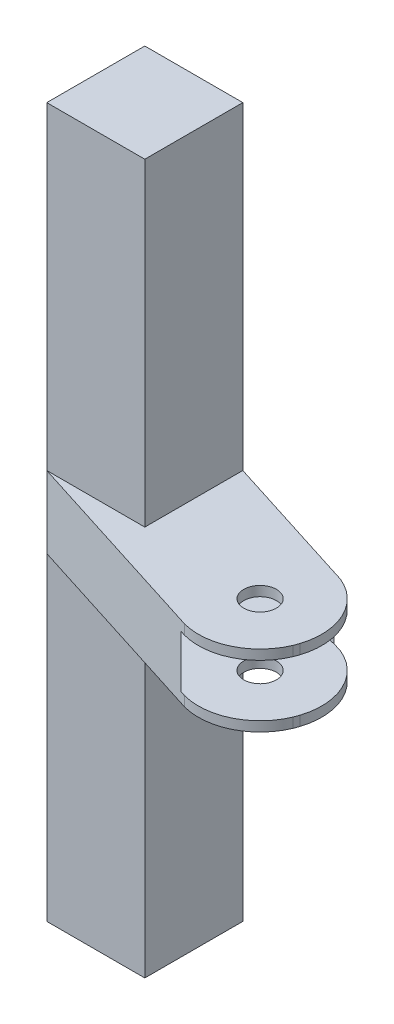
ISO-10303-21;
HEADER;
FILE_DESCRIPTION(('STEP AP214'),'2;1');
FILE_NAME('part.step','',(''),(''),'','','');
FILE_SCHEMA(('AUTOMOTIVE_DESIGN { 1 0 10303 214 1 1 1 1 }'));
ENDSEC;
DATA;
#1=APPLICATION_CONTEXT('core data for automotive mechanical design processes');
#2=APPLICATION_PROTOCOL_DEFINITION('international standard','automotive_design',2000,#1);
#3=PRODUCT_CONTEXT('',#1,'mechanical');
#4=PRODUCT('Part','Part','',(#3));
#5=PRODUCT_RELATED_PRODUCT_CATEGORY('part','',(#4));
#6=PRODUCT_DEFINITION_FORMATION('','',#4);
#7=PRODUCT_DEFINITION_CONTEXT('part definition',#1,'design');
#8=PRODUCT_DEFINITION('design','',#6,#7);
#9=PRODUCT_DEFINITION_SHAPE('','',#8);
#10=(LENGTH_UNIT() NAMED_UNIT(*) SI_UNIT(.MILLI.,.METRE.));
#11=(NAMED_UNIT(*) PLANE_ANGLE_UNIT() SI_UNIT($,.RADIAN.));
#12=(NAMED_UNIT(*) SI_UNIT($,.STERADIAN.) SOLID_ANGLE_UNIT());
#13=UNCERTAINTY_MEASURE_WITH_UNIT(LENGTH_MEASURE(1.E-05),#10,'distance_accuracy_value','');
#14=(GEOMETRIC_REPRESENTATION_CONTEXT(3) GLOBAL_UNCERTAINTY_ASSIGNED_CONTEXT((#13)) GLOBAL_UNIT_ASSIGNED_CONTEXT((#10,
#11,#12)) REPRESENTATION_CONTEXT('',''));
#15=CARTESIAN_POINT('',(0.,0.,0.));
#16=DIRECTION('',(0.,0.,1.));
#17=DIRECTION('',(1.,0.,0.));
#18=AXIS2_PLACEMENT_3D('',#15,#16,#17);
#19=CARTESIAN_POINT('',(0.,0.,0.));
#20=DIRECTION('',(0.,1.,0.));
#21=DIRECTION('',(0.,0.,1.));
#22=AXIS2_PLACEMENT_3D('',#19,#20,#21);
#23=PLANE('',#22);
#24=DIRECTION('',(0.,0.,1.));
#25=VECTOR('',#24,1.);
#26=CARTESIAN_POINT('',(-6.05504587155963,0.,0.));
#27=LINE('',#26,#25);
#28=CARTESIAN_POINT('',(-6.05504587155963,0.,-5.27064220183486));
#29=VERTEX_POINT('',#28);
#30=CARTESIAN_POINT('',(-6.05504587155964,0.,24.7293577981651));
#31=VERTEX_POINT('',#30);
#32=EDGE_CURVE('E717',#29,#31,#27,.T.);
#33=ORIENTED_EDGE('',*,*,#32,.T.);
#34=DIRECTION('',(-1.,0.,0.));
#35=VECTOR('',#34,1.);
#36=CARTESIAN_POINT('',(0.,0.,24.7293577981651));
#37=LINE('',#36,#35);
#38=CARTESIAN_POINT('',(-36.0550458715596,0.,24.7293577981651));
#39=VERTEX_POINT('',#38);
#40=EDGE_CURVE('E720',#31,#39,#37,.T.);
#41=ORIENTED_EDGE('',*,*,#40,.T.);
#42=DIRECTION('',(0.,0.,1.));
#43=VECTOR('',#42,1.);
#44=CARTESIAN_POINT('',(-36.0550458715596,0.,-5.27064220183486));
#45=LINE('',#44,#43);
#46=CARTESIAN_POINT('',(-36.0550458715596,0.,-5.27064220183486));
#47=VERTEX_POINT('',#46);
#48=EDGE_CURVE('E289',#47,#39,#45,.T.);
#49=ORIENTED_EDGE('',*,*,#48,.F.);
#50=DIRECTION('',(-1.,0.,0.));
#51=VECTOR('',#50,1.);
#52=CARTESIAN_POINT('',(-36.0550458715596,0.,-5.27064220183486));
#53=LINE('',#52,#51);
#54=EDGE_CURVE('E308',#29,#47,#53,.T.);
#55=ORIENTED_EDGE('',*,*,#54,.F.);
#56=EDGE_LOOP('',(#33,#41,#49,#55));
#57=FACE_BOUND('',#56,.T.);
#58=ADVANCED_FACE('F43',(#57),#23,.F.);
#59=CARTESIAN_POINT('',(-10.4155041147744,119.5,32.8569710340816));
#60=DIRECTION('',(0.302176376975282,0.,-0.953252032359802));
#61=DIRECTION('',(-0.953252032359802,0.,-0.302176376975282));
#62=AXIS2_PLACEMENT_3D('',#59,#60,#61);
#63=PLANE('',#62);
#64=DIRECTION('',(0.953252032359802,0.,0.302176376975282));
#65=VECTOR('',#64,1.);
#66=CARTESIAN_POINT('',(-10.4155041147744,97.5,32.8569710340816));
#67=LINE('',#66,#65);
#68=CARTESIAN_POINT('',(-36.0550458715596,97.5,24.7293577981651));
#69=VERTEX_POINT('',#68);
#70=CARTESIAN_POINT('',(25.6632165713357,97.5,44.2937545212811));
#71=VERTEX_POINT('',#70);
#72=EDGE_CURVE('E359',#69,#71,#67,.T.);
#73=ORIENTED_EDGE('',*,*,#72,.T.);
#74=DIRECTION('',(0.,-1.,0.));
#75=VECTOR('',#74,1.);
#76=CARTESIAN_POINT('',(25.6632165713357,100.5,44.2937545212811));
#77=LINE('',#76,#75);
#78=CARTESIAN_POINT('',(25.6632165713357,100.5,44.2937545212811));
#79=VERTEX_POINT('',#78);
#80=EDGE_CURVE('E215',#79,#71,#77,.T.);
#81=ORIENTED_EDGE('',*,*,#80,.F.);
#82=DIRECTION('',(0.953252032359802,0.,0.302176376975282));
#83=VECTOR('',#82,1.);
#84=CARTESIAN_POINT('',(-10.4155041147744,100.5,32.8569710340816));
#85=LINE('',#84,#83);
#86=CARTESIAN_POINT('',(24.0877510564104,100.5,43.7943394188856));
#87=VERTEX_POINT('',#86);
#88=EDGE_CURVE('E395',#87,#79,#85,.T.);
#89=ORIENTED_EDGE('',*,*,#88,.F.);
#90=DIRECTION('',(0.,-1.,0.));
#91=VECTOR('',#90,1.);
#92=CARTESIAN_POINT('',(24.0877510564104,116.5,43.7943394188856));
#93=LINE('',#92,#91);
#94=CARTESIAN_POINT('',(24.0877510564104,116.5,43.7943394188856));
#95=VERTEX_POINT('',#94);
#96=EDGE_CURVE('E259',#95,#87,#93,.T.);
#97=ORIENTED_EDGE('',*,*,#96,.F.);
#98=DIRECTION('',(0.953252032359802,0.,0.302176376975282));
#99=VECTOR('',#98,1.);
#100=CARTESIAN_POINT('',(-10.4155041147744,116.5,32.8569710340816));
#101=LINE('',#100,#99);
#102=CARTESIAN_POINT('',(25.6632165713357,116.5,44.2937545212811));
#103=VERTEX_POINT('',#102);
#104=EDGE_CURVE('E235',#95,#103,#101,.T.);
#105=ORIENTED_EDGE('',*,*,#104,.T.);
#106=DIRECTION('',(0.,-1.,0.));
#107=VECTOR('',#106,1.);
#108=CARTESIAN_POINT('',(25.6632165713357,119.5,44.2937545212811));
#109=LINE('',#108,#107);
#110=CARTESIAN_POINT('',(25.6632165713357,119.5,44.2937545212811));
#111=VERTEX_POINT('',#110);
#112=EDGE_CURVE('E290',#111,#103,#109,.T.);
#113=ORIENTED_EDGE('',*,*,#112,.F.);
#114=DIRECTION('',(0.953252032359802,0.,0.302176376975282));
#115=VECTOR('',#114,1.);
#116=CARTESIAN_POINT('',(-10.4155041147744,119.5,32.8569710340816));
#117=LINE('',#116,#115);
#118=CARTESIAN_POINT('',(-36.0550458715596,119.5,24.7293577981651));
#119=VERTEX_POINT('',#118);
#120=EDGE_CURVE('E277',#119,#111,#117,.T.);
#121=ORIENTED_EDGE('',*,*,#120,.F.);
#122=DIRECTION('',(0.,-1.,0.));
#123=VECTOR('',#122,1.);
#124=CARTESIAN_POINT('',(-36.0550458715596,119.5,24.7293577981651));
#125=LINE('',#124,#123);
#126=EDGE_CURVE('E286',#119,#69,#125,.T.);
#127=ORIENTED_EDGE('',*,*,#126,.T.);
#128=EDGE_LOOP('',(#73,#81,#89,#97,#105,#113,#121,#127));
#129=FACE_BOUND('',#128,.T.);
#130=ADVANCED_FACE('F356',(#129),#63,.F.);
#131=CARTESIAN_POINT('',(0.965320133767106,119.5,-3.04521944634541));
#132=DIRECTION('',(-0.302176376975282,0.,0.953252032359802));
#133=DIRECTION('',(0.953252032359802,0.,0.302176376975282));
#134=AXIS2_PLACEMENT_3D('',#131,#132,#133);
#135=PLANE('',#134);
#136=DIRECTION('',(-0.953252032359802,0.,-0.302176376975282));
#137=VECTOR('',#136,1.);
#138=CARTESIAN_POINT('',(0.965320133767106,97.5,-3.04521944634541));
#139=LINE('',#138,#137);
#140=CARTESIAN_POINT('',(37.6317572159582,97.5,8.57786735333382));
#141=VERTEX_POINT('',#140);
#142=CARTESIAN_POINT('',(-6.05504587155963,97.5,-5.27064220183486));
#143=VERTEX_POINT('',#142);
#144=EDGE_CURVE('E58',#141,#143,#139,.T.);
#145=ORIENTED_EDGE('',*,*,#144,.T.);
#146=DIRECTION('',(0.,-1.,0.));
#147=VECTOR('',#146,1.);
#148=CARTESIAN_POINT('',(-6.05504587155963,119.5,-5.27064220183486));
#149=LINE('',#148,#147);
#150=CARTESIAN_POINT('',(-6.05504587155963,119.5,-5.27064220183486));
#151=VERTEX_POINT('',#150);
#152=EDGE_CURVE('E285',#151,#143,#149,.T.);
#153=ORIENTED_EDGE('',*,*,#152,.F.);
#154=DIRECTION('',(-0.953252032359802,0.,-0.302176376975282));
#155=VECTOR('',#154,1.);
#156=CARTESIAN_POINT('',(0.965320133767106,119.5,-3.04521944634541));
#157=LINE('',#156,#155);
#158=CARTESIAN_POINT('',(37.6317572159582,119.5,8.57786735333382));
#159=VERTEX_POINT('',#158);
#160=EDGE_CURVE('E268',#159,#151,#157,.T.);
#161=ORIENTED_EDGE('',*,*,#160,.F.);
#162=DIRECTION('',(0.,-1.,0.));
#163=VECTOR('',#162,1.);
#164=CARTESIAN_POINT('',(37.6317572159582,119.5,8.57786735333382));
#165=LINE('',#164,#163);
#166=CARTESIAN_POINT('',(37.6317572159582,116.5,8.57786735333382));
#167=VERTEX_POINT('',#166);
#168=EDGE_CURVE('E299',#159,#167,#165,.T.);
#169=ORIENTED_EDGE('',*,*,#168,.T.);
#170=DIRECTION('',(-0.953252032359802,0.,-0.302176376975282));
#171=VECTOR('',#170,1.);
#172=CARTESIAN_POINT('',(0.965320133767106,116.5,-3.04521944634541));
#173=LINE('',#172,#171);
#174=CARTESIAN_POINT('',(34.8808589088709,116.5,7.70584562597882));
#175=VERTEX_POINT('',#174);
#176=EDGE_CURVE('E226',#167,#175,#173,.T.);
#177=ORIENTED_EDGE('',*,*,#176,.T.);
#178=DIRECTION('',(0.,-1.,0.));
#179=VECTOR('',#178,1.);
#180=CARTESIAN_POINT('',(34.8808589088709,116.5,7.70584562597881));
#181=LINE('',#180,#179);
#182=CARTESIAN_POINT('',(34.8808589088709,100.5,7.70584562597881));
#183=VERTEX_POINT('',#182);
#184=EDGE_CURVE('E261',#175,#183,#181,.T.);
#185=ORIENTED_EDGE('',*,*,#184,.T.);
#186=DIRECTION('',(-0.953252032359802,0.,-0.302176376975282));
#187=VECTOR('',#186,1.);
#188=CARTESIAN_POINT('',(0.965320133767106,100.5,-3.04521944634541));
#189=LINE('',#188,#187);
#190=CARTESIAN_POINT('',(37.6317572159582,100.5,8.57786735333382));
#191=VERTEX_POINT('',#190);
#192=EDGE_CURVE('E388',#191,#183,#189,.T.);
#193=ORIENTED_EDGE('',*,*,#192,.F.);
#194=DIRECTION('',(0.,-1.,0.));
#195=VECTOR('',#194,1.);
#196=CARTESIAN_POINT('',(37.6317572159582,100.5,8.57786735333382));
#197=LINE('',#196,#195);
#198=EDGE_CURVE('E213',#191,#141,#197,.T.);
#199=ORIENTED_EDGE('',*,*,#198,.T.);
#200=EDGE_LOOP('',(#145,#153,#161,#169,#177,#185,#193,#199));
#201=FACE_BOUND('',#200,.T.);
#202=ADVANCED_FACE('F337',(#201),#135,.F.);
#203=CARTESIAN_POINT('',(30.5715085198571,100.5,26.0752461601011));
#204=DIRECTION('',(0.,-1.,0.));
#205=DIRECTION('',(0.,0.,-1.));
#206=AXIS2_PLACEMENT_3D('',#203,#204,#205);
#207=CYLINDRICAL_SURFACE('',#206,18.8681047473853);
#208=ORIENTED_EDGE('',*,*,#80,.T.);
#209=CARTESIAN_POINT('',(30.5715085198571,97.5,26.0752461601011));
#210=DIRECTION('',(0.,-1.,0.));
#211=DIRECTION('',(0.,0.,-1.));
#212=AXIS2_PLACEMENT_3D('',#209,#210,#211);
#213=CIRCLE('',#212,18.8681047473853);
#214=CARTESIAN_POINT('',(47.9689901606505,97.5,33.3781914095577));
#215=VERTEX_POINT('',#214);
#216=EDGE_CURVE('E200',#215,#71,#213,.T.);
#217=ORIENTED_EDGE('',*,*,#216,.F.);
#218=DIRECTION('',(0.,-1.,0.));
#219=VECTOR('',#218,1.);
#220=CARTESIAN_POINT('',(47.9689901606505,100.5,33.3781914095577));
#221=LINE('',#220,#219);
#222=CARTESIAN_POINT('',(47.9689901606505,100.5,33.3781914095577));
#223=VERTEX_POINT('',#222);
#224=EDGE_CURVE('E208',#223,#215,#221,.T.);
#225=ORIENTED_EDGE('',*,*,#224,.F.);
#226=CARTESIAN_POINT('',(30.5715085198571,100.5,26.0752461601011));
#227=DIRECTION('',(0.,-1.,0.));
#228=DIRECTION('',(0.,0.,-1.));
#229=AXIS2_PLACEMENT_3D('',#226,#227,#228);
#230=CIRCLE('',#229,18.8681047473853);
#231=EDGE_CURVE('E396',#223,#79,#230,.T.);
#232=ORIENTED_EDGE('',*,*,#231,.T.);
#233=EDGE_LOOP('',(#208,#217,#225,#232));
#234=FACE_BOUND('',#233,.T.);
#235=ADVANCED_FACE('F413',(#234),#207,.T.);
#236=CARTESIAN_POINT('',(53.0600347067889,100.5,19.5864936980411));
#237=DIRECTION('',(-0.938124642710191,0.,-0.346297783330874));
#238=DIRECTION('',(-0.346297783330874,0.,0.938124642710191));
#239=AXIS2_PLACEMENT_3D('',#236,#237,#238);
#240=PLANE('',#239);
#241=DIRECTION('',(0.346297783330874,0.,-0.938124642710191));
#242=VECTOR('',#241,1.);
#243=CARTESIAN_POINT('',(53.0600347067889,97.5,19.5864936980411));
#244=LINE('',#243,#242);
#245=CARTESIAN_POINT('',(48.5413259092379,97.5,31.8277273422184));
#246=VERTEX_POINT('',#245);
#247=EDGE_CURVE('E194',#215,#246,#244,.T.);
#248=ORIENTED_EDGE('',*,*,#247,.T.);
#249=DIRECTION('',(0.,-1.,0.));
#250=VECTOR('',#249,1.);
#251=CARTESIAN_POINT('',(48.5413259092379,100.5,31.8277273422184));
#252=LINE('',#251,#250);
#253=CARTESIAN_POINT('',(48.5413259092379,100.5,31.8277273422184));
#254=VERTEX_POINT('',#253);
#255=EDGE_CURVE('E206',#254,#246,#252,.T.);
#256=ORIENTED_EDGE('',*,*,#255,.F.);
#257=DIRECTION('',(0.346297783330874,0.,-0.938124642710191));
#258=VECTOR('',#257,1.);
#259=CARTESIAN_POINT('',(53.0600347067889,100.5,19.5864936980411));
#260=LINE('',#259,#258);
#261=EDGE_CURVE('E397',#223,#254,#260,.T.);
#262=ORIENTED_EDGE('',*,*,#261,.F.);
#263=ORIENTED_EDGE('',*,*,#224,.T.);
#264=EDGE_LOOP('',(#248,#256,#262,#263));
#265=FACE_BOUND('',#264,.T.);
#266=ADVANCED_FACE('F204',(#265),#240,.F.);
#267=ORIENTED_EDGE('',*,*,#255,.T.);
#268=EDGE_CURVE('E191',#141,#246,#213,.T.);
#269=ORIENTED_EDGE('',*,*,#268,.F.);
#270=ORIENTED_EDGE('',*,*,#198,.F.);
#271=EDGE_CURVE('E212',#191,#254,#230,.T.);
#272=ORIENTED_EDGE('',*,*,#271,.T.);
#273=EDGE_LOOP('',(#267,#269,#270,#272));
#274=FACE_BOUND('',#273,.T.);
#275=ADVANCED_FACE('F210',(#274),#207,.T.);
#276=CARTESIAN_POINT('',(30.5715085198571,100.5,26.0752461601011));
#277=DIRECTION('',(0.,-1.,0.));
#278=DIRECTION('',(0.,0.,-1.));
#279=AXIS2_PLACEMENT_3D('',#276,#277,#278);
#280=CYLINDRICAL_SURFACE('',#279,5.);
#281=CARTESIAN_POINT('',(30.5715085198571,100.5,26.0752461601011));
#282=DIRECTION('',(0.,-1.,0.));
#283=DIRECTION('',(0.,0.,-1.));
#284=AXIS2_PLACEMENT_3D('',#281,#282,#283);
#285=CIRCLE('',#284,5.);
#286=CARTESIAN_POINT('',(30.5715085198571,100.5,21.0752461601011));
#287=VERTEX_POINT('',#286);
#288=EDGE_CURVE('E217',#287,#287,#285,.T.);
#289=ORIENTED_EDGE('',*,*,#288,.F.);
#290=EDGE_LOOP('',(#289));
#291=FACE_BOUND('',#290,.T.);
#292=CARTESIAN_POINT('',(30.5715085198571,97.5,26.0752461601011));
#293=DIRECTION('',(0.,-1.,0.));
#294=DIRECTION('',(0.,0.,-1.));
#295=AXIS2_PLACEMENT_3D('',#292,#293,#294);
#296=CIRCLE('',#295,5.);
#297=CARTESIAN_POINT('',(30.5715085198571,97.5,21.0752461601011));
#298=VERTEX_POINT('',#297);
#299=EDGE_CURVE('E715',#298,#298,#296,.T.);
#300=ORIENTED_EDGE('',*,*,#299,.T.);
#301=EDGE_LOOP('',(#300));
#302=FACE_BOUND('',#301,.T.);
#303=ADVANCED_FACE('F434',(#291,#302),#280,.F.);
#304=CARTESIAN_POINT('',(0.29986938486549,116.5,-0.982407606553388));
#305=DIRECTION('',(-0.291941851766884,0.,0.956436069576489));
#306=DIRECTION('',(0.956436069576489,0.,0.291941851766884));
#307=AXIS2_PLACEMENT_3D('',#304,#305,#306);
#308=PLANE('',#307);
#309=DIRECTION('',(0.,-1.,0.));
#310=VECTOR('',#309,1.);
#311=CARTESIAN_POINT('',(-6.05504587155963,116.5,-2.92217732749656));
#312=LINE('',#311,#310);
#313=CARTESIAN_POINT('',(-6.05504587155963,116.5,-2.92217732749656));
#314=VERTEX_POINT('',#313);
#315=CARTESIAN_POINT('',(-6.05504587155963,100.5,-2.92217732749656));
#316=VERTEX_POINT('',#315);
#317=EDGE_CURVE('E248',#314,#316,#312,.T.);
#318=ORIENTED_EDGE('',*,*,#317,.T.);
#319=DIRECTION('',(-0.956436069576489,0.,-0.291941851766884));
#320=VECTOR('',#319,1.);
#321=CARTESIAN_POINT('',(0.29986938486549,100.5,-0.982407606553388));
#322=LINE('',#321,#320);
#323=CARTESIAN_POINT('',(27.8001994914144,100.5,7.41177319746156));
#324=VERTEX_POINT('',#323);
#325=EDGE_CURVE('E389',#324,#316,#322,.T.);
#326=ORIENTED_EDGE('',*,*,#325,.F.);
#327=DIRECTION('',(0.,-1.,0.));
#328=VECTOR('',#327,1.);
#329=CARTESIAN_POINT('',(27.8001994914144,116.5,7.41177319746156));
#330=LINE('',#329,#328);
#331=CARTESIAN_POINT('',(27.8001994914144,116.5,7.41177319746156));
#332=VERTEX_POINT('',#331);
#333=EDGE_CURVE('E247',#332,#324,#330,.T.);
#334=ORIENTED_EDGE('',*,*,#333,.F.);
#335=DIRECTION('',(-0.956436069576489,0.,-0.291941851766884));
#336=VECTOR('',#335,1.);
#337=CARTESIAN_POINT('',(0.29986938486549,116.5,-0.982407606553388));
#338=LINE('',#337,#336);
#339=EDGE_CURVE('E221',#332,#314,#338,.T.);
#340=ORIENTED_EDGE('',*,*,#339,.T.);
#341=EDGE_LOOP('',(#318,#326,#334,#340));
#342=FACE_BOUND('',#341,.T.);
#343=ADVANCED_FACE('F432',(#342),#308,.T.);
#344=CARTESIAN_POINT('',(-6.05504587155963,116.5,0.));
#345=DIRECTION('',(1.,0.,0.));
#346=DIRECTION('',(0.,0.,-1.));
#347=AXIS2_PLACEMENT_3D('',#344,#345,#346);
#348=PLANE('',#347);
#349=DIRECTION('',(0.,-1.,0.));
#350=VECTOR('',#349,1.);
#351=CARTESIAN_POINT('',(-6.05504587155964,116.5,24.7293577981651));
#352=LINE('',#351,#350);
#353=CARTESIAN_POINT('',(-6.05504587155964,116.5,24.7293577981651));
#354=VERTEX_POINT('',#353);
#355=CARTESIAN_POINT('',(-6.05504587155964,100.5,24.7293577981651));
#356=VERTEX_POINT('',#355);
#357=EDGE_CURVE('E251',#354,#356,#352,.T.);
#358=ORIENTED_EDGE('',*,*,#357,.T.);
#359=DIRECTION('',(0.,0.,1.));
#360=VECTOR('',#359,1.);
#361=CARTESIAN_POINT('',(-6.05504587155963,100.5,0.));
#362=LINE('',#361,#360);
#363=EDGE_CURVE('E66',#316,#356,#362,.T.);
#364=ORIENTED_EDGE('',*,*,#363,.F.);
#365=ORIENTED_EDGE('',*,*,#317,.F.);
#366=DIRECTION('',(0.,0.,1.));
#367=VECTOR('',#366,1.);
#368=CARTESIAN_POINT('',(-6.05504587155963,116.5,0.));
#369=LINE('',#368,#367);
#370=EDGE_CURVE('E242',#314,#354,#369,.T.);
#371=ORIENTED_EDGE('',*,*,#370,.T.);
#372=EDGE_LOOP('',(#358,#364,#365,#371));
#373=FACE_BOUND('',#372,.T.);
#374=ADVANCED_FACE('F430',(#373),#348,.T.);
#375=CARTESIAN_POINT('',(0.,116.5,24.7293577981651));
#376=DIRECTION('',(0.,0.,1.));
#377=DIRECTION('',(1.,0.,0.));
#378=AXIS2_PLACEMENT_3D('',#375,#376,#377);
#379=PLANE('',#378);
#380=DIRECTION('',(0.,-1.,0.));
#381=VECTOR('',#380,1.);
#382=CARTESIAN_POINT('',(-27.7534787692139,116.5,24.7293577981651));
#383=LINE('',#382,#381);
#384=CARTESIAN_POINT('',(-27.7534787692139,116.5,24.7293577981651));
#385=VERTEX_POINT('',#384);
#386=CARTESIAN_POINT('',(-27.7534787692139,100.5,24.7293577981651));
#387=VERTEX_POINT('',#386);
#388=EDGE_CURVE('E253',#385,#387,#383,.T.);
#389=ORIENTED_EDGE('',*,*,#388,.T.);
#390=DIRECTION('',(-1.,0.,0.));
#391=VECTOR('',#390,1.);
#392=CARTESIAN_POINT('',(0.,100.5,24.7293577981651));
#393=LINE('',#392,#391);
#394=EDGE_CURVE('E408',#356,#387,#393,.T.);
#395=ORIENTED_EDGE('',*,*,#394,.F.);
#396=ORIENTED_EDGE('',*,*,#357,.F.);
#397=DIRECTION('',(-1.,0.,0.));
#398=VECTOR('',#397,1.);
#399=CARTESIAN_POINT('',(0.,116.5,24.7293577981651));
#400=LINE('',#399,#398);
#401=EDGE_CURVE('E240',#354,#385,#400,.T.);
#402=ORIENTED_EDGE('',*,*,#401,.T.);
#403=EDGE_LOOP('',(#389,#395,#396,#402));
#404=FACE_BOUND('',#403,.T.);
#405=ADVANCED_FACE('F429',(#404),#379,.T.);
#406=CARTESIAN_POINT('',(-9.65748335052139,116.5,30.4657025923589));
#407=DIRECTION('',(0.302176376975281,0.,-0.953252032359802));
#408=DIRECTION('',(-0.953252032359802,0.,-0.302176376975281));
#409=AXIS2_PLACEMENT_3D('',#406,#407,#408);
#410=PLANE('',#409);
#411=DIRECTION('',(0.,-1.,0.));
#412=VECTOR('',#411,1.);
#413=CARTESIAN_POINT('',(16.6424639953112,116.5,38.8026612704651));
#414=LINE('',#413,#412);
#415=CARTESIAN_POINT('',(16.6424639953112,116.5,38.8026612704651));
#416=VERTEX_POINT('',#415);
#417=CARTESIAN_POINT('',(16.6424639953112,100.5,38.8026612704651));
#418=VERTEX_POINT('',#417);
#419=EDGE_CURVE('E256',#416,#418,#414,.T.);
#420=ORIENTED_EDGE('',*,*,#419,.T.);
#421=DIRECTION('',(0.953252032359802,0.,0.302176376975281));
#422=VECTOR('',#421,1.);
#423=CARTESIAN_POINT('',(-9.65748335052139,100.5,30.4657025923589));
#424=LINE('',#423,#422);
#425=EDGE_CURVE('E394',#387,#418,#424,.T.);
#426=ORIENTED_EDGE('',*,*,#425,.F.);
#427=ORIENTED_EDGE('',*,*,#388,.F.);
#428=DIRECTION('',(0.953252032359802,0.,0.302176376975281));
#429=VECTOR('',#428,1.);
#430=CARTESIAN_POINT('',(-9.65748335052139,116.5,30.4657025923589));
#431=LINE('',#430,#429);
#432=EDGE_CURVE('E238',#385,#416,#431,.T.);
#433=ORIENTED_EDGE('',*,*,#432,.T.);
#434=EDGE_LOOP('',(#420,#426,#427,#433));
#435=FACE_BOUND('',#434,.T.);
#436=ADVANCED_FACE('F423',(#435),#410,.T.);
#437=CARTESIAN_POINT('',(30.5715085198571,116.5,26.0752461601011));
#438=DIRECTION('',(0.,-1.,0.));
#439=DIRECTION('',(0.,0.,-1.));
#440=AXIS2_PLACEMENT_3D('',#437,#438,#439);
#441=CYLINDRICAL_SURFACE('',#440,18.8681047473853);
#442=EDGE_CURVE('E391',#87,#418,#230,.T.);
#443=ORIENTED_EDGE('',*,*,#442,.T.);
#444=ORIENTED_EDGE('',*,*,#419,.F.);
#445=CARTESIAN_POINT('',(30.5715085198571,116.5,26.0752461601011));
#446=DIRECTION('',(0.,-1.,0.));
#447=DIRECTION('',(0.,0.,-1.));
#448=AXIS2_PLACEMENT_3D('',#445,#446,#447);
#449=CIRCLE('',#448,18.8681047473853);
#450=EDGE_CURVE('E227',#95,#416,#449,.T.);
#451=ORIENTED_EDGE('',*,*,#450,.F.);
#452=ORIENTED_EDGE('',*,*,#96,.T.);
#453=EDGE_LOOP('',(#443,#444,#451,#452));
#454=FACE_BOUND('',#453,.T.);
#455=ADVANCED_FACE('F419',(#454),#441,.F.);
#456=EDGE_CURVE('E385',#324,#183,#230,.T.);
#457=ORIENTED_EDGE('',*,*,#456,.T.);
#458=ORIENTED_EDGE('',*,*,#184,.F.);
#459=EDGE_CURVE('E224',#332,#175,#449,.T.);
#460=ORIENTED_EDGE('',*,*,#459,.F.);
#461=ORIENTED_EDGE('',*,*,#333,.T.);
#462=EDGE_LOOP('',(#457,#458,#460,#461));
#463=FACE_BOUND('',#462,.T.);
#464=ADVANCED_FACE('F383',(#463),#441,.F.);
#465=CARTESIAN_POINT('',(30.5715085198571,119.5,26.0752461601011));
#466=DIRECTION('',(0.,-1.,0.));
#467=DIRECTION('',(0.,0.,-1.));
#468=AXIS2_PLACEMENT_3D('',#465,#466,#467);
#469=CYLINDRICAL_SURFACE('',#468,18.8681047473853);
#470=ORIENTED_EDGE('',*,*,#112,.T.);
#471=CARTESIAN_POINT('',(47.9689901606505,116.5,33.3781914095577));
#472=VERTEX_POINT('',#471);
#473=EDGE_CURVE('E234',#472,#103,#449,.T.);
#474=ORIENTED_EDGE('',*,*,#473,.F.);
#475=DIRECTION('',(0.,-1.,0.));
#476=VECTOR('',#475,1.);
#477=CARTESIAN_POINT('',(47.9689901606505,119.5,33.3781914095577));
#478=LINE('',#477,#476);
#479=CARTESIAN_POINT('',(47.9689901606505,119.5,33.3781914095577));
#480=VERTEX_POINT('',#479);
#481=EDGE_CURVE('E293',#480,#472,#478,.T.);
#482=ORIENTED_EDGE('',*,*,#481,.F.);
#483=CARTESIAN_POINT('',(30.5715085198571,119.5,26.0752461601011));
#484=DIRECTION('',(0.,-1.,0.));
#485=DIRECTION('',(0.,0.,-1.));
#486=AXIS2_PLACEMENT_3D('',#483,#484,#485);
#487=CIRCLE('',#486,18.8681047473853);
#488=EDGE_CURVE('E275',#480,#111,#487,.T.);
#489=ORIENTED_EDGE('',*,*,#488,.T.);
#490=EDGE_LOOP('',(#470,#474,#482,#489));
#491=FACE_BOUND('',#490,.T.);
#492=ADVANCED_FACE('F367',(#491),#469,.T.);
#493=CARTESIAN_POINT('',(53.0600347067889,119.5,19.5864936980411));
#494=DIRECTION('',(-0.938124642710191,0.,-0.346297783330874));
#495=DIRECTION('',(-0.346297783330874,0.,0.938124642710191));
#496=AXIS2_PLACEMENT_3D('',#493,#494,#495);
#497=PLANE('',#496);
#498=DIRECTION('',(0.346297783330874,0.,-0.938124642710191));
#499=VECTOR('',#498,1.);
#500=CARTESIAN_POINT('',(53.0600347067889,116.5,19.5864936980411));
#501=LINE('',#500,#499);
#502=CARTESIAN_POINT('',(48.5413259092379,116.5,31.8277273422184));
#503=VERTEX_POINT('',#502);
#504=EDGE_CURVE('E231',#472,#503,#501,.T.);
#505=ORIENTED_EDGE('',*,*,#504,.T.);
#506=DIRECTION('',(0.,-1.,0.));
#507=VECTOR('',#506,1.);
#508=CARTESIAN_POINT('',(48.5413259092379,119.5,31.8277273422184));
#509=LINE('',#508,#507);
#510=CARTESIAN_POINT('',(48.5413259092379,119.5,31.8277273422184));
#511=VERTEX_POINT('',#510);
#512=EDGE_CURVE('E296',#511,#503,#509,.T.);
#513=ORIENTED_EDGE('',*,*,#512,.F.);
#514=DIRECTION('',(0.346297783330874,0.,-0.938124642710191));
#515=VECTOR('',#514,1.);
#516=CARTESIAN_POINT('',(53.0600347067889,119.5,19.5864936980411));
#517=LINE('',#516,#515);
#518=EDGE_CURVE('E274',#480,#511,#517,.T.);
#519=ORIENTED_EDGE('',*,*,#518,.F.);
#520=ORIENTED_EDGE('',*,*,#481,.T.);
#521=EDGE_LOOP('',(#505,#513,#519,#520));
#522=FACE_BOUND('',#521,.T.);
#523=ADVANCED_FACE('F370',(#522),#497,.F.);
#524=ORIENTED_EDGE('',*,*,#512,.T.);
#525=EDGE_CURVE('E228',#167,#503,#449,.T.);
#526=ORIENTED_EDGE('',*,*,#525,.F.);
#527=ORIENTED_EDGE('',*,*,#168,.F.);
#528=EDGE_CURVE('E271',#159,#511,#487,.T.);
#529=ORIENTED_EDGE('',*,*,#528,.T.);
#530=EDGE_LOOP('',(#524,#526,#527,#529));
#531=FACE_BOUND('',#530,.T.);
#532=ADVANCED_FACE('F373',(#531),#469,.T.);
#533=CARTESIAN_POINT('',(30.5715085198571,119.5,26.0752461601011));
#534=DIRECTION('',(0.,-1.,0.));
#535=DIRECTION('',(0.,0.,-1.));
#536=AXIS2_PLACEMENT_3D('',#533,#534,#535);
#537=CYLINDRICAL_SURFACE('',#536,5.);
#538=CARTESIAN_POINT('',(30.5715085198571,119.5,26.0752461601011));
#539=DIRECTION('',(0.,-1.,0.));
#540=DIRECTION('',(0.,0.,-1.));
#541=AXIS2_PLACEMENT_3D('',#538,#539,#540);
#542=CIRCLE('',#541,5.);
#543=CARTESIAN_POINT('',(30.5715085198571,119.5,21.0752461601011));
#544=VERTEX_POINT('',#543);
#545=EDGE_CURVE('E282',#544,#544,#542,.T.);
#546=CARTESIAN_POINT('',(30.5715085198571,116.5,26.0752461601011));
#547=DIRECTION('',(0.,-1.,0.));
#548=DIRECTION('',(0.,0.,-1.));
#549=AXIS2_PLACEMENT_3D('',#546,#547,#548);
#550=CIRCLE('',#549,5.);
#551=CARTESIAN_POINT('',(30.5715085198571,116.5,21.0752461601011));
#552=VERTEX_POINT('',#551);
#553=EDGE_CURVE('E244',#552,#552,#550,.T.);
#554=CARTESIAN_POINT('',(30.5715085198571,119.5,21.0752461601011));
#555=CARTESIAN_POINT('',(30.5715085198571,119.46875,21.0752461601011));
#556=CARTESIAN_POINT('',(30.5715085198571,119.4375,21.0752461601011));
#557=CARTESIAN_POINT('',(30.5715085198571,119.375,21.0752461601011));
#558=CARTESIAN_POINT('',(30.5715085198571,119.34375,21.0752461601011));
#559=CARTESIAN_POINT('',(30.5715085198571,119.28125,21.0752461601011));
#560=CARTESIAN_POINT('',(30.5715085198571,119.25,21.0752461601011));
#561=CARTESIAN_POINT('',(30.5715085198571,119.1875,21.0752461601011));
#562=CARTESIAN_POINT('',(30.5715085198571,119.15625,21.0752461601011));
#563=CARTESIAN_POINT('',(30.5715085198571,119.09375,21.0752461601011));
#564=CARTESIAN_POINT('',(30.5715085198571,119.0625,21.0752461601011));
#565=CARTESIAN_POINT('',(30.5715085198571,119.,21.0752461601011));
#566=CARTESIAN_POINT('',(30.5715085198571,118.96875,21.0752461601011));
#567=CARTESIAN_POINT('',(30.5715085198571,118.90625,21.0752461601011));
#568=CARTESIAN_POINT('',(30.5715085198571,118.875,21.0752461601011));
#569=CARTESIAN_POINT('',(30.5715085198571,118.8125,21.0752461601011));
#570=CARTESIAN_POINT('',(30.5715085198571,118.78125,21.0752461601011));
#571=CARTESIAN_POINT('',(30.5715085198571,118.71875,21.0752461601011));
#572=CARTESIAN_POINT('',(30.5715085198571,118.6875,21.0752461601011));
#573=CARTESIAN_POINT('',(30.5715085198571,118.625,21.0752461601011));
#574=CARTESIAN_POINT('',(30.5715085198571,118.59375,21.0752461601011));
#575=CARTESIAN_POINT('',(30.5715085198571,118.53125,21.0752461601011));
#576=CARTESIAN_POINT('',(30.5715085198571,118.5,21.0752461601011));
#577=CARTESIAN_POINT('',(30.5715085198571,118.4375,21.0752461601011));
#578=CARTESIAN_POINT('',(30.5715085198571,118.40625,21.0752461601011));
#579=CARTESIAN_POINT('',(30.5715085198571,118.34375,21.0752461601011));
#580=CARTESIAN_POINT('',(30.5715085198571,118.3125,21.0752461601011));
#581=CARTESIAN_POINT('',(30.5715085198571,118.25,21.0752461601011));
#582=CARTESIAN_POINT('',(30.5715085198571,118.21875,21.0752461601011));
#583=CARTESIAN_POINT('',(30.5715085198571,118.15625,21.0752461601011));
#584=CARTESIAN_POINT('',(30.5715085198571,118.125,21.0752461601011));
#585=CARTESIAN_POINT('',(30.5715085198571,118.0625,21.0752461601011));
#586=CARTESIAN_POINT('',(30.5715085198571,118.03125,21.0752461601011));
#587=CARTESIAN_POINT('',(30.5715085198571,117.96875,21.0752461601011));
#588=CARTESIAN_POINT('',(30.5715085198571,117.9375,21.0752461601011));
#589=CARTESIAN_POINT('',(30.5715085198571,117.875,21.0752461601011));
#590=CARTESIAN_POINT('',(30.5715085198571,117.84375,21.0752461601011));
#591=CARTESIAN_POINT('',(30.5715085198571,117.78125,21.0752461601011));
#592=CARTESIAN_POINT('',(30.5715085198571,117.75,21.0752461601011));
#593=CARTESIAN_POINT('',(30.5715085198571,117.6875,21.0752461601011));
#594=CARTESIAN_POINT('',(30.5715085198571,117.65625,21.0752461601011));
#595=CARTESIAN_POINT('',(30.5715085198571,117.59375,21.0752461601011));
#596=CARTESIAN_POINT('',(30.5715085198571,117.5625,21.0752461601011));
#597=CARTESIAN_POINT('',(30.5715085198571,117.5,21.0752461601011));
#598=CARTESIAN_POINT('',(30.5715085198571,117.46875,21.0752461601011));
#599=CARTESIAN_POINT('',(30.5715085198571,117.40625,21.0752461601011));
#600=CARTESIAN_POINT('',(30.5715085198571,117.375,21.0752461601011));
#601=CARTESIAN_POINT('',(30.5715085198571,117.3125,21.0752461601011));
#602=CARTESIAN_POINT('',(30.5715085198571,117.28125,21.0752461601011));
#603=CARTESIAN_POINT('',(30.5715085198571,117.21875,21.0752461601011));
#604=CARTESIAN_POINT('',(30.5715085198571,117.1875,21.0752461601011));
#605=CARTESIAN_POINT('',(30.5715085198571,117.125,21.0752461601011));
#606=CARTESIAN_POINT('',(30.5715085198571,117.09375,21.0752461601011));
#607=CARTESIAN_POINT('',(30.5715085198571,117.03125,21.0752461601011));
#608=CARTESIAN_POINT('',(30.5715085198571,117.,21.0752461601011));
#609=CARTESIAN_POINT('',(30.5715085198571,116.9375,21.0752461601011));
#610=CARTESIAN_POINT('',(30.5715085198571,116.90625,21.0752461601011));
#611=CARTESIAN_POINT('',(30.5715085198571,116.84375,21.0752461601011));
#612=CARTESIAN_POINT('',(30.5715085198571,116.8125,21.0752461601011));
#613=CARTESIAN_POINT('',(30.5715085198571,116.75,21.0752461601011));
#614=CARTESIAN_POINT('',(30.5715085198571,116.71875,21.0752461601011));
#615=CARTESIAN_POINT('',(30.5715085198571,116.65625,21.0752461601011));
#616=CARTESIAN_POINT('',(30.5715085198571,116.625,21.0752461601011));
#617=CARTESIAN_POINT('',(30.5715085198571,116.5625,21.0752461601011));
#618=CARTESIAN_POINT('',(30.5715085198571,116.53125,21.0752461601011));
#619=CARTESIAN_POINT('',(30.5715085198571,116.5,21.0752461601011));
#620=B_SPLINE_CURVE_WITH_KNOTS('',3,(#554,#555,#556,#557,#558,#559,#560,#561,#562,#563,#564,
#565,#566,#567,#568,#569,#570,#571,#572,#573,#574,#575,#576,#577,#578,#579,#580,#581,#582,#583,
#584,#585,#586,#587,#588,#589,#590,#591,#592,#593,#594,#595,#596,#597,#598,#599,#600,#601,#602,
#603,#604,#605,#606,#607,#608,#609,#610,#611,#612,#613,#614,#615,#616,#617,#618,#619),
.UNSPECIFIED.,.F.,.F.,(4,2,2,2,2,2,2,2,2,2,2,2,2,2,2,2,2,2,2,2,2,2,2,2,2,2,2,2,2,2,2,2,4),(0.,
0.0937500000000036,0.187500000000007,0.281250000000011,0.375,0.468750000000004,
0.562500000000007,0.656250000000011,0.750000000000001,0.843750000000004,0.937500000000008,
1.03125,1.125,1.21875,1.31250000000001,1.40625,1.5,1.59375,1.68749999999999,1.78125,1.875,
1.96875000000001,2.06249999999999,2.15625,2.25,2.34374999999999,2.4375,2.53125,2.625,
2.71874999999999,2.8125,2.90625,3.),.UNSPECIFIED.);
#621=EDGE_CURVE('BSEAM462',#544,#552,#620,.T.);
#622=ORIENTED_EDGE('',*,*,#545,.F.);
#623=ORIENTED_EDGE('',*,*,#553,.T.);
#624=ORIENTED_EDGE('',*,*,#621,.T.);
#625=ORIENTED_EDGE('',*,*,#621,.F.);
#626=EDGE_LOOP('',(#622,#624,#623,#625));
#627=FACE_BOUND('',#626,.T.);
#628=ADVANCED_FACE('F462',(#627),#537,.F.);
#629=CARTESIAN_POINT('',(-36.0550458715596,217.,24.7293577981651));
#630=DIRECTION('',(0.,0.,-1.));
#631=DIRECTION('',(-1.,0.,0.));
#632=AXIS2_PLACEMENT_3D('',#629,#630,#631);
#633=PLANE('',#632);
#634=DIRECTION('',(-1.,0.,0.));
#635=VECTOR('',#634,1.);
#636=CARTESIAN_POINT('',(0.,119.5,24.7293577981651));
#637=LINE('',#636,#635);
#638=CARTESIAN_POINT('',(-6.05504587155963,119.5,24.7293577981651));
#639=VERTEX_POINT('',#638);
#640=EDGE_CURVE('E279',#639,#119,#637,.T.);
#641=ORIENTED_EDGE('',*,*,#640,.F.);
#642=DIRECTION('',(0.,-1.,0.));
#643=VECTOR('',#642,1.);
#644=CARTESIAN_POINT('',(-6.05504587155963,217.,24.7293577981651));
#645=LINE('',#644,#643);
#646=CARTESIAN_POINT('',(-6.05504587155963,217.,24.7293577981651));
#647=VERTEX_POINT('',#646);
#648=EDGE_CURVE('E51',#647,#639,#645,.T.);
#649=ORIENTED_EDGE('',*,*,#648,.F.);
#650=DIRECTION('',(1.,0.,0.));
#651=VECTOR('',#650,1.);
#652=CARTESIAN_POINT('',(-36.0550458715596,217.,24.7293577981651));
#653=LINE('',#652,#651);
#654=CARTESIAN_POINT('',(-36.0550458715596,217.,24.7293577981651));
#655=VERTEX_POINT('',#654);
#656=EDGE_CURVE('E307',#655,#647,#653,.T.);
#657=ORIENTED_EDGE('',*,*,#656,.F.);
#658=DIRECTION('',(0.,-1.,0.));
#659=VECTOR('',#658,1.);
#660=CARTESIAN_POINT('',(-36.0550458715596,217.,24.7293577981651));
#661=LINE('',#660,#659);
#662=EDGE_CURVE('E12',#655,#119,#661,.T.);
#663=ORIENTED_EDGE('',*,*,#662,.T.);
#664=EDGE_LOOP('',(#641,#649,#657,#663));
#665=FACE_BOUND('',#664,.T.);
#666=ADVANCED_FACE('F350',(#665),#633,.F.);
#667=CARTESIAN_POINT('',(-6.05504587155963,217.,-5.27064220183486));
#668=DIRECTION('',(-1.,0.,0.));
#669=DIRECTION('',(0.,0.,1.));
#670=AXIS2_PLACEMENT_3D('',#667,#668,#669);
#671=PLANE('',#670);
#672=DIRECTION('',(0.,0.,1.));
#673=VECTOR('',#672,1.);
#674=CARTESIAN_POINT('',(-6.05504587155963,119.5,0.));
#675=LINE('',#674,#673);
#676=EDGE_CURVE('E250',#151,#639,#675,.T.);
#677=ORIENTED_EDGE('',*,*,#676,.F.);
#678=DIRECTION('',(0.,-1.,0.));
#679=VECTOR('',#678,1.);
#680=CARTESIAN_POINT('',(-6.05504587155963,217.,-5.27064220183486));
#681=LINE('',#680,#679);
#682=CARTESIAN_POINT('',(-6.05504587155963,217.,-5.27064220183486));
#683=VERTEX_POINT('',#682);
#684=EDGE_CURVE('E320',#683,#151,#681,.T.);
#685=ORIENTED_EDGE('',*,*,#684,.F.);
#686=DIRECTION('',(0.,0.,-1.));
#687=VECTOR('',#686,1.);
#688=CARTESIAN_POINT('',(-6.05504587155963,217.,-5.27064220183486));
#689=LINE('',#688,#687);
#690=EDGE_CURVE('E310',#647,#683,#689,.T.);
#691=ORIENTED_EDGE('',*,*,#690,.F.);
#692=ORIENTED_EDGE('',*,*,#648,.T.);
#693=EDGE_LOOP('',(#677,#685,#691,#692));
#694=FACE_BOUND('',#693,.T.);
#695=ADVANCED_FACE('F326',(#694),#671,.F.);
#696=CARTESIAN_POINT('',(-36.0550458715596,217.,-5.27064220183486));
#697=DIRECTION('',(1.,0.,0.));
#698=DIRECTION('',(0.,0.,-1.));
#699=AXIS2_PLACEMENT_3D('',#696,#697,#698);
#700=PLANE('',#699);
#701=ORIENTED_EDGE('',*,*,#48,.T.);
#702=DIRECTION('',(0.,-1.,0.));
#703=VECTOR('',#702,1.);
#704=CARTESIAN_POINT('',(-36.0550458715596,97.5,24.7293577981651));
#705=LINE('',#704,#703);
#706=EDGE_CURVE('E353',#69,#39,#705,.T.);
#707=ORIENTED_EDGE('',*,*,#706,.F.);
#708=ORIENTED_EDGE('',*,*,#126,.F.);
#709=ORIENTED_EDGE('',*,*,#662,.F.);
#710=DIRECTION('',(0.,0.,1.));
#711=VECTOR('',#710,1.);
#712=CARTESIAN_POINT('',(-36.0550458715596,217.,-5.27064220183486));
#713=LINE('',#712,#711);
#714=CARTESIAN_POINT('',(-36.0550458715596,217.,-5.27064220183486));
#715=VERTEX_POINT('',#714);
#716=EDGE_CURVE('E304',#715,#655,#713,.T.);
#717=ORIENTED_EDGE('',*,*,#716,.F.);
#718=DIRECTION('',(0.,-1.,0.));
#719=VECTOR('',#718,1.);
#720=CARTESIAN_POINT('',(-36.0550458715596,217.,-5.27064220183486));
#721=LINE('',#720,#719);
#722=EDGE_CURVE('E314',#715,#47,#721,.T.);
#723=ORIENTED_EDGE('',*,*,#722,.T.);
#724=EDGE_LOOP('',(#701,#707,#708,#709,#717,#723));
#725=FACE_BOUND('',#724,.T.);
#726=ADVANCED_FACE('F45',(#725),#700,.F.);
#727=CARTESIAN_POINT('',(-36.0550458715596,217.,-5.27064220183486));
#728=DIRECTION('',(0.,0.,1.));
#729=DIRECTION('',(1.,0.,0.));
#730=AXIS2_PLACEMENT_3D('',#727,#728,#729);
#731=PLANE('',#730);
#732=ORIENTED_EDGE('',*,*,#54,.T.);
#733=ORIENTED_EDGE('',*,*,#722,.F.);
#734=DIRECTION('',(-1.,0.,0.));
#735=VECTOR('',#734,1.);
#736=CARTESIAN_POINT('',(-36.0550458715596,217.,-5.27064220183486));
#737=LINE('',#736,#735);
#738=EDGE_CURVE('E312',#683,#715,#737,.T.);
#739=ORIENTED_EDGE('',*,*,#738,.F.);
#740=ORIENTED_EDGE('',*,*,#684,.T.);
#741=ORIENTED_EDGE('',*,*,#152,.T.);
#742=DIRECTION('',(0.,-1.,0.));
#743=VECTOR('',#742,1.);
#744=CARTESIAN_POINT('',(-6.05504587155963,97.5,-5.27064220183486));
#745=LINE('',#744,#743);
#746=EDGE_CURVE('E342',#143,#29,#745,.T.);
#747=ORIENTED_EDGE('',*,*,#746,.T.);
#748=EDGE_LOOP('',(#732,#733,#739,#740,#741,#747));
#749=FACE_BOUND('',#748,.T.);
#750=ADVANCED_FACE('F340',(#749),#731,.F.);
#751=CARTESIAN_POINT('',(0.,217.,0.));
#752=DIRECTION('',(0.,1.,0.));
#753=DIRECTION('',(0.,0.,1.));
#754=AXIS2_PLACEMENT_3D('',#751,#752,#753);
#755=PLANE('',#754);
#756=ORIENTED_EDGE('',*,*,#716,.T.);
#757=ORIENTED_EDGE('',*,*,#656,.T.);
#758=ORIENTED_EDGE('',*,*,#690,.T.);
#759=ORIENTED_EDGE('',*,*,#738,.T.);
#760=EDGE_LOOP('',(#756,#757,#758,#759));
#761=FACE_BOUND('',#760,.T.);
#762=ADVANCED_FACE('F348',(#761),#755,.T.);
#763=CARTESIAN_POINT('',(0.,119.5,0.));
#764=DIRECTION('',(0.,-1.,0.));
#765=DIRECTION('',(0.,0.,-1.));
#766=AXIS2_PLACEMENT_3D('',#763,#764,#765);
#767=PLANE('',#766);
#768=ORIENTED_EDGE('',*,*,#676,.T.);
#769=ORIENTED_EDGE('',*,*,#640,.T.);
#770=ORIENTED_EDGE('',*,*,#120,.T.);
#771=ORIENTED_EDGE('',*,*,#488,.F.);
#772=ORIENTED_EDGE('',*,*,#518,.T.);
#773=ORIENTED_EDGE('',*,*,#528,.F.);
#774=ORIENTED_EDGE('',*,*,#160,.T.);
#775=EDGE_LOOP('',(#768,#769,#770,#771,#772,#773,#774));
#776=FACE_BOUND('',#775,.T.);
#777=ORIENTED_EDGE('',*,*,#545,.T.);
#778=EDGE_LOOP('',(#777));
#779=FACE_BOUND('',#778,.T.);
#780=ADVANCED_FACE('F330',(#776,#779),#767,.F.);
#781=CARTESIAN_POINT('',(0.,116.5,0.));
#782=DIRECTION('',(0.,-1.,0.));
#783=DIRECTION('',(0.,0.,-1.));
#784=AXIS2_PLACEMENT_3D('',#781,#782,#783);
#785=PLANE('',#784);
#786=ORIENTED_EDGE('',*,*,#339,.F.);
#787=ORIENTED_EDGE('',*,*,#459,.T.);
#788=ORIENTED_EDGE('',*,*,#176,.F.);
#789=ORIENTED_EDGE('',*,*,#525,.T.);
#790=ORIENTED_EDGE('',*,*,#504,.F.);
#791=ORIENTED_EDGE('',*,*,#473,.T.);
#792=ORIENTED_EDGE('',*,*,#104,.F.);
#793=ORIENTED_EDGE('',*,*,#450,.T.);
#794=ORIENTED_EDGE('',*,*,#432,.F.);
#795=ORIENTED_EDGE('',*,*,#401,.F.);
#796=ORIENTED_EDGE('',*,*,#370,.F.);
#797=EDGE_LOOP('',(#786,#787,#788,#789,#790,#791,#792,#793,#794,#795,#796));
#798=FACE_BOUND('',#797,.T.);
#799=ORIENTED_EDGE('',*,*,#553,.F.);
#800=EDGE_LOOP('',(#799));
#801=FACE_BOUND('',#800,.T.);
#802=ADVANCED_FACE('F379',(#798,#801),#785,.T.);
#803=CARTESIAN_POINT('',(0.,100.5,0.));
#804=DIRECTION('',(0.,-1.,0.));
#805=DIRECTION('',(0.,0.,-1.));
#806=AXIS2_PLACEMENT_3D('',#803,#804,#805);
#807=PLANE('',#806);
#808=ORIENTED_EDGE('',*,*,#325,.T.);
#809=ORIENTED_EDGE('',*,*,#363,.T.);
#810=ORIENTED_EDGE('',*,*,#394,.T.);
#811=ORIENTED_EDGE('',*,*,#425,.T.);
#812=ORIENTED_EDGE('',*,*,#442,.F.);
#813=ORIENTED_EDGE('',*,*,#88,.T.);
#814=ORIENTED_EDGE('',*,*,#231,.F.);
#815=ORIENTED_EDGE('',*,*,#261,.T.);
#816=ORIENTED_EDGE('',*,*,#271,.F.);
#817=ORIENTED_EDGE('',*,*,#192,.T.);
#818=ORIENTED_EDGE('',*,*,#456,.F.);
#819=EDGE_LOOP('',(#808,#809,#810,#811,#812,#813,#814,#815,#816,#817,#818));
#820=FACE_BOUND('',#819,.T.);
#821=ORIENTED_EDGE('',*,*,#288,.T.);
#822=EDGE_LOOP('',(#821));
#823=FACE_BOUND('',#822,.T.);
#824=ADVANCED_FACE('F415',(#820,#823),#807,.F.);
#825=CARTESIAN_POINT('',(-6.05504587155963,97.5,0.));
#826=DIRECTION('',(1.,0.,0.));
#827=DIRECTION('',(0.,0.,-1.));
#828=AXIS2_PLACEMENT_3D('',#825,#826,#827);
#829=PLANE('',#828);
#830=ORIENTED_EDGE('',*,*,#32,.F.);
#831=ORIENTED_EDGE('',*,*,#746,.F.);
#832=DIRECTION('',(0.,0.,1.));
#833=VECTOR('',#832,1.);
#834=CARTESIAN_POINT('',(-6.05504587155963,97.5,0.));
#835=LINE('',#834,#833);
#836=CARTESIAN_POINT('',(-6.05504587155964,97.5,24.7293577981651));
#837=VERTEX_POINT('',#836);
#838=EDGE_CURVE('E726',#143,#837,#835,.T.);
#839=ORIENTED_EDGE('',*,*,#838,.T.);
#840=DIRECTION('',(0.,-1.,0.));
#841=VECTOR('',#840,1.);
#842=CARTESIAN_POINT('',(-6.05504587155964,97.5,24.7293577981651));
#843=LINE('',#842,#841);
#844=EDGE_CURVE('E731',#837,#31,#843,.T.);
#845=ORIENTED_EDGE('',*,*,#844,.T.);
#846=EDGE_LOOP('',(#830,#831,#839,#845));
#847=FACE_BOUND('',#846,.T.);
#848=ADVANCED_FACE('F512',(#847),#829,.T.);
#849=CARTESIAN_POINT('',(0.,97.5,24.7293577981651));
#850=DIRECTION('',(0.,0.,1.));
#851=DIRECTION('',(1.,0.,0.));
#852=AXIS2_PLACEMENT_3D('',#849,#850,#851);
#853=PLANE('',#852);
#854=ORIENTED_EDGE('',*,*,#40,.F.);
#855=ORIENTED_EDGE('',*,*,#844,.F.);
#856=DIRECTION('',(-1.,0.,0.));
#857=VECTOR('',#856,1.);
#858=CARTESIAN_POINT('',(0.,97.5,24.7293577981651));
#859=LINE('',#858,#857);
#860=EDGE_CURVE('E724',#837,#69,#859,.T.);
#861=ORIENTED_EDGE('',*,*,#860,.T.);
#862=ORIENTED_EDGE('',*,*,#706,.T.);
#863=EDGE_LOOP('',(#854,#855,#861,#862));
#864=FACE_BOUND('',#863,.T.);
#865=ADVANCED_FACE('F516',(#864),#853,.T.);
#866=CARTESIAN_POINT('',(0.,97.5,0.));
#867=DIRECTION('',(0.,-1.,0.));
#868=DIRECTION('',(0.,0.,-1.));
#869=AXIS2_PLACEMENT_3D('',#866,#867,#868);
#870=PLANE('',#869);
#871=ORIENTED_EDGE('',*,*,#299,.F.);
#872=EDGE_LOOP('',(#871));
#873=FACE_BOUND('',#872,.T.);
#874=ORIENTED_EDGE('',*,*,#144,.F.);
#875=ORIENTED_EDGE('',*,*,#268,.T.);
#876=ORIENTED_EDGE('',*,*,#247,.F.);
#877=ORIENTED_EDGE('',*,*,#216,.T.);
#878=ORIENTED_EDGE('',*,*,#72,.F.);
#879=ORIENTED_EDGE('',*,*,#860,.F.);
#880=ORIENTED_EDGE('',*,*,#838,.F.);
#881=EDGE_LOOP('',(#874,#875,#876,#877,#878,#879,#880));
#882=FACE_BOUND('',#881,.T.);
#883=ADVANCED_FACE('F193',(#873,#882),#870,.T.);
#884=CLOSED_SHELL('',(#58,#130,#202,#235,#266,#275,#303,#343,#374,#405,#436,#455,#464,#492,#523,
#532,#628,#666,#695,#726,#750,#762,#780,#802,#824,#848,#865,#883));
#885=MANIFOLD_SOLID_BREP('B2',#884);
#886=ADVANCED_BREP_SHAPE_REPRESENTATION('',(#18,#885),#14);
#887=SHAPE_DEFINITION_REPRESENTATION(#9,#886);
ENDSEC;
END-ISO-10303-21;
